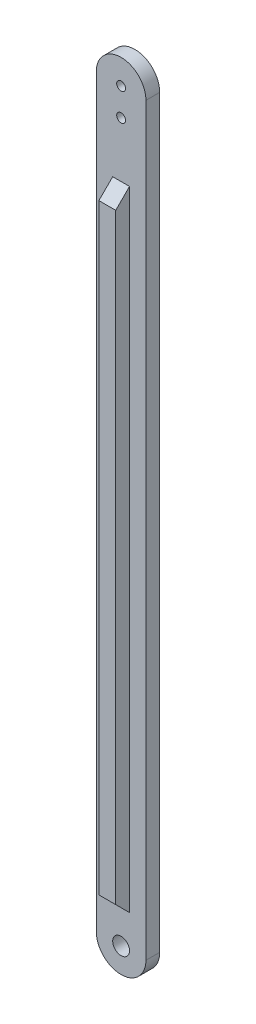
ISO-10303-21;
HEADER;
FILE_DESCRIPTION(('STEP AP214'),'2;1');
FILE_NAME('part.step','',(''),(''),'','','');
FILE_SCHEMA(('AUTOMOTIVE_DESIGN { 1 0 10303 214 1 1 1 1 }'));
ENDSEC;
DATA;
#1=APPLICATION_CONTEXT('core data for automotive mechanical design processes');
#2=APPLICATION_PROTOCOL_DEFINITION('international standard','automotive_design',2000,#1);
#3=PRODUCT_CONTEXT('',#1,'mechanical');
#4=PRODUCT('Part','Part','',(#3));
#5=PRODUCT_RELATED_PRODUCT_CATEGORY('part','',(#4));
#6=PRODUCT_DEFINITION_FORMATION('','',#4);
#7=PRODUCT_DEFINITION_CONTEXT('part definition',#1,'design');
#8=PRODUCT_DEFINITION('design','',#6,#7);
#9=PRODUCT_DEFINITION_SHAPE('','',#8);
#10=(LENGTH_UNIT() NAMED_UNIT(*) SI_UNIT(.MILLI.,.METRE.));
#11=(NAMED_UNIT(*) PLANE_ANGLE_UNIT() SI_UNIT($,.RADIAN.));
#12=(NAMED_UNIT(*) SI_UNIT($,.STERADIAN.) SOLID_ANGLE_UNIT());
#13=UNCERTAINTY_MEASURE_WITH_UNIT(LENGTH_MEASURE(1.E-05),#10,'distance_accuracy_value','');
#14=(GEOMETRIC_REPRESENTATION_CONTEXT(3) GLOBAL_UNCERTAINTY_ASSIGNED_CONTEXT((#13)) GLOBAL_UNIT_ASSIGNED_CONTEXT((#10,
#11,#12)) REPRESENTATION_CONTEXT('',''));
#15=CARTESIAN_POINT('',(0.,0.,0.));
#16=DIRECTION('',(0.,0.,1.));
#17=DIRECTION('',(1.,0.,0.));
#18=AXIS2_PLACEMENT_3D('',#15,#16,#17);
#19=CARTESIAN_POINT('',(0.,0.,5.));
#20=DIRECTION('',(0.,0.,1.));
#21=DIRECTION('',(1.,0.,0.));
#22=AXIS2_PLACEMENT_3D('',#19,#20,#21);
#23=PLANE('',#22);
#24=CARTESIAN_POINT('',(0.,270.,5.));
#25=DIRECTION('',(0.,0.,1.));
#26=DIRECTION('',(1.,0.,0.));
#27=AXIS2_PLACEMENT_3D('',#24,#25,#26);
#28=CIRCLE('',#27,1.6);
#29=CARTESIAN_POINT('',(1.6,270.,5.));
#30=VERTEX_POINT('',#29);
#31=EDGE_CURVE('E144',#30,#30,#28,.T.);
#32=ORIENTED_EDGE('',*,*,#31,.F.);
#33=EDGE_LOOP('',(#32));
#34=FACE_BOUND('',#33,.T.);
#35=CARTESIAN_POINT('',(0.,260.,5.));
#36=DIRECTION('',(0.,0.,1.));
#37=DIRECTION('',(1.,0.,0.));
#38=AXIS2_PLACEMENT_3D('',#35,#36,#37);
#39=CIRCLE('',#38,1.59999999999999);
#40=CARTESIAN_POINT('',(1.59999999999999,260.,5.));
#41=VERTEX_POINT('',#40);
#42=EDGE_CURVE('E149',#41,#41,#39,.T.);
#43=ORIENTED_EDGE('',*,*,#42,.F.);
#44=EDGE_LOOP('',(#43));
#45=FACE_BOUND('',#44,.T.);
#46=CARTESIAN_POINT('',(0.,0.,5.));
#47=DIRECTION('',(0.,0.,1.));
#48=DIRECTION('',(1.,0.,0.));
#49=AXIS2_PLACEMENT_3D('',#46,#47,#48);
#50=CIRCLE('',#49,9.00000000000003);
#51=CARTESIAN_POINT('',(-9.00000000000003,0.,5.));
#52=VERTEX_POINT('',#51);
#53=CARTESIAN_POINT('',(9.00000000000003,0.,5.));
#54=VERTEX_POINT('',#53);
#55=EDGE_CURVE('E163',#52,#54,#50,.T.);
#56=ORIENTED_EDGE('',*,*,#55,.T.);
#57=DIRECTION('',(0.,1.,0.));
#58=VECTOR('',#57,1.);
#59=CARTESIAN_POINT('',(9.,270.,5.));
#60=LINE('',#59,#58);
#61=CARTESIAN_POINT('',(9.,270.,5.));
#62=VERTEX_POINT('',#61);
#63=EDGE_CURVE('E167',#54,#62,#60,.T.);
#64=ORIENTED_EDGE('',*,*,#63,.T.);
#65=CARTESIAN_POINT('',(0.,270.,5.));
#66=DIRECTION('',(0.,0.,1.));
#67=DIRECTION('',(1.,0.,0.));
#68=AXIS2_PLACEMENT_3D('',#65,#66,#67);
#69=CIRCLE('',#68,9.);
#70=CARTESIAN_POINT('',(-9.,270.,5.));
#71=VERTEX_POINT('',#70);
#72=EDGE_CURVE('E171',#62,#71,#69,.T.);
#73=ORIENTED_EDGE('',*,*,#72,.T.);
#74=DIRECTION('',(0.,-1.,0.));
#75=VECTOR('',#74,1.);
#76=CARTESIAN_POINT('',(-9.,270.,5.));
#77=LINE('',#76,#75);
#78=EDGE_CURVE('E174',#71,#52,#77,.T.);
#79=ORIENTED_EDGE('',*,*,#78,.T.);
#80=EDGE_LOOP('',(#56,#64,#73,#79));
#81=FACE_BOUND('',#80,.T.);
#82=CARTESIAN_POINT('',(0.,0.,5.));
#83=DIRECTION('',(0.,0.,1.));
#84=DIRECTION('',(1.,0.,0.));
#85=AXIS2_PLACEMENT_3D('',#82,#83,#84);
#86=CIRCLE('',#85,3.05);
#87=CARTESIAN_POINT('',(3.05,0.,5.));
#88=VERTEX_POINT('',#87);
#89=EDGE_CURVE('E153',#88,#88,#86,.T.);
#90=ORIENTED_EDGE('',*,*,#89,.F.);
#91=EDGE_LOOP('',(#90));
#92=FACE_BOUND('',#91,.T.);
#93=DIRECTION('',(0.,-1.,0.));
#94=VECTOR('',#93,1.);
#95=CARTESIAN_POINT('',(-3.05,12.,5.));
#96=LINE('',#95,#94);
#97=CARTESIAN_POINT('',(-3.05,240.,5.));
#98=VERTEX_POINT('',#97);
#99=CARTESIAN_POINT('',(-3.05,12.,5.));
#100=VERTEX_POINT('',#99);
#101=EDGE_CURVE('E113',#98,#100,#96,.T.);
#102=ORIENTED_EDGE('',*,*,#101,.F.);
#103=DIRECTION('',(-1.,0.,0.));
#104=VECTOR('',#103,1.);
#105=CARTESIAN_POINT('',(3.05,240.,5.));
#106=LINE('',#105,#104);
#107=CARTESIAN_POINT('',(3.05,240.,5.));
#108=VERTEX_POINT('',#107);
#109=EDGE_CURVE('E127',#108,#98,#106,.T.);
#110=ORIENTED_EDGE('',*,*,#109,.F.);
#111=DIRECTION('',(0.,1.,0.));
#112=VECTOR('',#111,1.);
#113=CARTESIAN_POINT('',(3.05,12.,5.));
#114=LINE('',#113,#112);
#115=CARTESIAN_POINT('',(3.05,12.,5.));
#116=VERTEX_POINT('',#115);
#117=EDGE_CURVE('E141',#116,#108,#114,.T.);
#118=ORIENTED_EDGE('',*,*,#117,.F.);
#119=DIRECTION('',(1.,0.,0.));
#120=VECTOR('',#119,1.);
#121=CARTESIAN_POINT('',(0.,12.,5.));
#122=LINE('',#121,#120);
#123=EDGE_CURVE('E128',#100,#116,#122,.T.);
#124=ORIENTED_EDGE('',*,*,#123,.F.);
#125=EDGE_LOOP('',(#102,#110,#118,#124));
#126=FACE_BOUND('',#125,.T.);
#127=ADVANCED_FACE('F45',(#34,#45,#81,#92,#126),#23,.T.);
#128=CARTESIAN_POINT('',(0.,0.,0.));
#129=DIRECTION('',(0.,0.,1.));
#130=DIRECTION('',(1.,0.,0.));
#131=AXIS2_PLACEMENT_3D('',#128,#129,#130);
#132=PLANE('',#131);
#133=CARTESIAN_POINT('',(0.,270.,0.));
#134=DIRECTION('',(0.,0.,1.));
#135=DIRECTION('',(1.,0.,0.));
#136=AXIS2_PLACEMENT_3D('',#133,#134,#135);
#137=CIRCLE('',#136,1.6);
#138=CARTESIAN_POINT('',(1.6,270.,0.));
#139=VERTEX_POINT('',#138);
#140=EDGE_CURVE('E162',#139,#139,#137,.T.);
#141=ORIENTED_EDGE('',*,*,#140,.T.);
#142=EDGE_LOOP('',(#141));
#143=FACE_BOUND('',#142,.T.);
#144=CARTESIAN_POINT('',(0.,260.,0.));
#145=DIRECTION('',(0.,0.,1.));
#146=DIRECTION('',(1.,0.,0.));
#147=AXIS2_PLACEMENT_3D('',#144,#145,#146);
#148=CIRCLE('',#147,1.59999999999999);
#149=CARTESIAN_POINT('',(1.59999999999999,260.,0.));
#150=VERTEX_POINT('',#149);
#151=EDGE_CURVE('E148',#150,#150,#148,.T.);
#152=ORIENTED_EDGE('',*,*,#151,.T.);
#153=EDGE_LOOP('',(#152));
#154=FACE_BOUND('',#153,.T.);
#155=CARTESIAN_POINT('',(0.,0.,0.));
#156=DIRECTION('',(0.,0.,1.));
#157=DIRECTION('',(1.,0.,0.));
#158=AXIS2_PLACEMENT_3D('',#155,#156,#157);
#159=CIRCLE('',#158,9.00000000000003);
#160=CARTESIAN_POINT('',(-9.00000000000003,0.,0.));
#161=VERTEX_POINT('',#160);
#162=CARTESIAN_POINT('',(9.00000000000003,0.,0.));
#163=VERTEX_POINT('',#162);
#164=EDGE_CURVE('E157',#161,#163,#159,.T.);
#165=ORIENTED_EDGE('',*,*,#164,.F.);
#166=DIRECTION('',(0.,-1.,0.));
#167=VECTOR('',#166,1.);
#168=CARTESIAN_POINT('',(-9.,270.,0.));
#169=LINE('',#168,#167);
#170=CARTESIAN_POINT('',(-9.,270.,0.));
#171=VERTEX_POINT('',#170);
#172=EDGE_CURVE('E168',#171,#161,#169,.T.);
#173=ORIENTED_EDGE('',*,*,#172,.F.);
#174=CARTESIAN_POINT('',(0.,270.,0.));
#175=DIRECTION('',(0.,0.,1.));
#176=DIRECTION('',(1.,0.,0.));
#177=AXIS2_PLACEMENT_3D('',#174,#175,#176);
#178=CIRCLE('',#177,9.);
#179=CARTESIAN_POINT('',(9.,270.,0.));
#180=VERTEX_POINT('',#179);
#181=EDGE_CURVE('E184',#180,#171,#178,.T.);
#182=ORIENTED_EDGE('',*,*,#181,.F.);
#183=DIRECTION('',(0.,1.,0.));
#184=VECTOR('',#183,1.);
#185=CARTESIAN_POINT('',(9.,270.,0.));
#186=LINE('',#185,#184);
#187=EDGE_CURVE('E181',#163,#180,#186,.T.);
#188=ORIENTED_EDGE('',*,*,#187,.F.);
#189=EDGE_LOOP('',(#165,#173,#182,#188));
#190=FACE_BOUND('',#189,.T.);
#191=CARTESIAN_POINT('',(0.,0.,0.));
#192=DIRECTION('',(0.,0.,1.));
#193=DIRECTION('',(1.,0.,0.));
#194=AXIS2_PLACEMENT_3D('',#191,#192,#193);
#195=CIRCLE('',#194,3.05);
#196=CARTESIAN_POINT('',(3.05,0.,0.));
#197=VERTEX_POINT('',#196);
#198=EDGE_CURVE('E158',#197,#197,#195,.T.);
#199=ORIENTED_EDGE('',*,*,#198,.T.);
#200=EDGE_LOOP('',(#199));
#201=FACE_BOUND('',#200,.T.);
#202=ADVANCED_FACE('F231',(#143,#154,#190,#201),#132,.F.);
#203=CARTESIAN_POINT('',(0.,0.,5.));
#204=DIRECTION('',(0.,0.,-1.));
#205=DIRECTION('',(-1.,0.,0.));
#206=AXIS2_PLACEMENT_3D('',#203,#204,#205);
#207=CYLINDRICAL_SURFACE('',#206,9.00000000000003);
#208=ORIENTED_EDGE('',*,*,#164,.T.);
#209=DIRECTION('',(0.,0.,-1.));
#210=VECTOR('',#209,1.);
#211=CARTESIAN_POINT('',(9.00000000000003,0.,5.));
#212=LINE('',#211,#210);
#213=EDGE_CURVE('E200',#54,#163,#212,.T.);
#214=ORIENTED_EDGE('',*,*,#213,.F.);
#215=ORIENTED_EDGE('',*,*,#55,.F.);
#216=DIRECTION('',(0.,0.,-1.));
#217=VECTOR('',#216,1.);
#218=CARTESIAN_POINT('',(-9.00000000000003,0.,5.));
#219=LINE('',#218,#217);
#220=EDGE_CURVE('E177',#52,#161,#219,.T.);
#221=ORIENTED_EDGE('',*,*,#220,.T.);
#222=EDGE_LOOP('',(#208,#214,#215,#221));
#223=FACE_BOUND('',#222,.T.);
#224=ADVANCED_FACE('F237',(#223),#207,.T.);
#225=CARTESIAN_POINT('',(9.,270.,5.));
#226=DIRECTION('',(-1.,0.,0.));
#227=DIRECTION('',(0.,-1.,0.));
#228=AXIS2_PLACEMENT_3D('',#225,#226,#227);
#229=PLANE('',#228);
#230=ORIENTED_EDGE('',*,*,#187,.T.);
#231=DIRECTION('',(0.,0.,-1.));
#232=VECTOR('',#231,1.);
#233=CARTESIAN_POINT('',(9.,270.,5.));
#234=LINE('',#233,#232);
#235=EDGE_CURVE('E196',#62,#180,#234,.T.);
#236=ORIENTED_EDGE('',*,*,#235,.F.);
#237=ORIENTED_EDGE('',*,*,#63,.F.);
#238=ORIENTED_EDGE('',*,*,#213,.T.);
#239=EDGE_LOOP('',(#230,#236,#237,#238));
#240=FACE_BOUND('',#239,.T.);
#241=ADVANCED_FACE('F253',(#240),#229,.F.);
#242=CARTESIAN_POINT('',(0.,270.,5.));
#243=DIRECTION('',(0.,0.,-1.));
#244=DIRECTION('',(-1.,0.,0.));
#245=AXIS2_PLACEMENT_3D('',#242,#243,#244);
#246=CYLINDRICAL_SURFACE('',#245,9.);
#247=ORIENTED_EDGE('',*,*,#181,.T.);
#248=DIRECTION('',(0.,0.,-1.));
#249=VECTOR('',#248,1.);
#250=CARTESIAN_POINT('',(-9.,270.,5.));
#251=LINE('',#250,#249);
#252=EDGE_CURVE('E192',#71,#171,#251,.T.);
#253=ORIENTED_EDGE('',*,*,#252,.F.);
#254=ORIENTED_EDGE('',*,*,#72,.F.);
#255=ORIENTED_EDGE('',*,*,#235,.T.);
#256=EDGE_LOOP('',(#247,#253,#254,#255));
#257=FACE_BOUND('',#256,.T.);
#258=ADVANCED_FACE('F249',(#257),#246,.T.);
#259=CARTESIAN_POINT('',(-9.,270.,5.));
#260=DIRECTION('',(1.,0.,0.));
#261=DIRECTION('',(0.,1.,0.));
#262=AXIS2_PLACEMENT_3D('',#259,#260,#261);
#263=PLANE('',#262);
#264=ORIENTED_EDGE('',*,*,#172,.T.);
#265=ORIENTED_EDGE('',*,*,#220,.F.);
#266=ORIENTED_EDGE('',*,*,#78,.F.);
#267=ORIENTED_EDGE('',*,*,#252,.T.);
#268=EDGE_LOOP('',(#264,#265,#266,#267));
#269=FACE_BOUND('',#268,.T.);
#270=ADVANCED_FACE('F246',(#269),#263,.F.);
#271=CARTESIAN_POINT('',(0.,0.,5.));
#272=DIRECTION('',(0.,0.,-1.));
#273=DIRECTION('',(-1.,0.,0.));
#274=AXIS2_PLACEMENT_3D('',#271,#272,#273);
#275=CYLINDRICAL_SURFACE('',#274,3.05);
#276=ORIENTED_EDGE('',*,*,#89,.T.);
#277=EDGE_LOOP('',(#276));
#278=FACE_BOUND('',#277,.T.);
#279=ORIENTED_EDGE('',*,*,#198,.F.);
#280=EDGE_LOOP('',(#279));
#281=FACE_BOUND('',#280,.T.);
#282=ADVANCED_FACE('F243',(#278,#281),#275,.F.);
#283=CARTESIAN_POINT('',(0.,260.,-5.));
#284=DIRECTION('',(0.,0.,1.));
#285=DIRECTION('',(1.,0.,0.));
#286=AXIS2_PLACEMENT_3D('',#283,#284,#285);
#287=CYLINDRICAL_SURFACE('',#286,1.59999999999999);
#288=ORIENTED_EDGE('',*,*,#42,.T.);
#289=EDGE_LOOP('',(#288));
#290=FACE_BOUND('',#289,.T.);
#291=ORIENTED_EDGE('',*,*,#151,.F.);
#292=EDGE_LOOP('',(#291));
#293=FACE_BOUND('',#292,.T.);
#294=ADVANCED_FACE('F285',(#290,#293),#287,.F.);
#295=CARTESIAN_POINT('',(0.,270.,-5.));
#296=DIRECTION('',(0.,0.,1.));
#297=DIRECTION('',(1.,0.,0.));
#298=AXIS2_PLACEMENT_3D('',#295,#296,#297);
#299=CYLINDRICAL_SURFACE('',#298,1.6);
#300=ORIENTED_EDGE('',*,*,#31,.T.);
#301=EDGE_LOOP('',(#300));
#302=FACE_BOUND('',#301,.T.);
#303=ORIENTED_EDGE('',*,*,#140,.F.);
#304=EDGE_LOOP('',(#303));
#305=FACE_BOUND('',#304,.T.);
#306=ADVANCED_FACE('F290',(#302,#305),#299,.F.);
#307=CARTESIAN_POINT('',(-3.05,12.,10.));
#308=DIRECTION('',(1.,0.,0.));
#309=DIRECTION('',(0.,0.,-1.));
#310=AXIS2_PLACEMENT_3D('',#307,#308,#309);
#311=PLANE('',#310);
#312=DIRECTION('',(0.,-1.,0.));
#313=VECTOR('',#312,1.);
#314=CARTESIAN_POINT('',(-3.05,12.,10.));
#315=LINE('',#314,#313);
#316=CARTESIAN_POINT('',(-3.05,235.,10.));
#317=VERTEX_POINT('',#316);
#318=CARTESIAN_POINT('',(-3.05,17.,10.));
#319=VERTEX_POINT('',#318);
#320=EDGE_CURVE('E116',#317,#319,#315,.T.);
#321=ORIENTED_EDGE('',*,*,#320,.F.);
#322=DIRECTION('',(0.,-0.707106781186546,0.707106781186549));
#323=VECTOR('',#322,1.);
#324=CARTESIAN_POINT('',(-3.05,235.,10.));
#325=LINE('',#324,#323);
#326=EDGE_CURVE('E110',#317,#98,#325,.F.);
#327=ORIENTED_EDGE('',*,*,#326,.T.);
#328=ORIENTED_EDGE('',*,*,#101,.T.);
#329=DIRECTION('',(0.,-0.707106781186546,-0.707106781186549));
#330=VECTOR('',#329,1.);
#331=CARTESIAN_POINT('',(-3.05,17.,10.));
#332=LINE('',#331,#330);
#333=EDGE_CURVE('E122',#100,#319,#332,.F.);
#334=ORIENTED_EDGE('',*,*,#333,.T.);
#335=EDGE_LOOP('',(#321,#327,#328,#334));
#336=FACE_BOUND('',#335,.T.);
#337=ADVANCED_FACE('F112',(#336),#311,.F.);
#338=CARTESIAN_POINT('',(3.05,12.,10.));
#339=DIRECTION('',(-1.,0.,0.));
#340=DIRECTION('',(0.,0.,1.));
#341=AXIS2_PLACEMENT_3D('',#338,#339,#340);
#342=PLANE('',#341);
#343=ORIENTED_EDGE('',*,*,#117,.T.);
#344=DIRECTION('',(0.,0.707106781186546,-0.707106781186549));
#345=VECTOR('',#344,1.);
#346=CARTESIAN_POINT('',(3.05,235.,10.));
#347=LINE('',#346,#345);
#348=CARTESIAN_POINT('',(3.05,235.,10.));
#349=VERTEX_POINT('',#348);
#350=EDGE_CURVE('E11',#108,#349,#347,.F.);
#351=ORIENTED_EDGE('',*,*,#350,.T.);
#352=DIRECTION('',(0.,1.,0.));
#353=VECTOR('',#352,1.);
#354=CARTESIAN_POINT('',(3.05,12.,10.));
#355=LINE('',#354,#353);
#356=CARTESIAN_POINT('',(3.05,17.,10.));
#357=VERTEX_POINT('',#356);
#358=EDGE_CURVE('E136',#357,#349,#355,.T.);
#359=ORIENTED_EDGE('',*,*,#358,.F.);
#360=DIRECTION('',(0.,0.707106781186546,0.707106781186549));
#361=VECTOR('',#360,1.);
#362=CARTESIAN_POINT('',(3.05,17.,10.));
#363=LINE('',#362,#361);
#364=EDGE_CURVE('E55',#357,#116,#363,.F.);
#365=ORIENTED_EDGE('',*,*,#364,.T.);
#366=EDGE_LOOP('',(#343,#351,#359,#365));
#367=FACE_BOUND('',#366,.T.);
#368=ADVANCED_FACE('F218',(#367),#342,.F.);
#369=CARTESIAN_POINT('',(0.,0.,10.));
#370=DIRECTION('',(0.,0.,-1.));
#371=DIRECTION('',(-1.,0.,0.));
#372=AXIS2_PLACEMENT_3D('',#369,#370,#371);
#373=PLANE('',#372);
#374=ORIENTED_EDGE('',*,*,#358,.T.);
#375=DIRECTION('',(-1.,0.,0.));
#376=VECTOR('',#375,1.);
#377=CARTESIAN_POINT('',(0.,235.,10.));
#378=LINE('',#377,#376);
#379=EDGE_CURVE('E213',#349,#317,#378,.T.);
#380=ORIENTED_EDGE('',*,*,#379,.T.);
#381=ORIENTED_EDGE('',*,*,#320,.T.);
#382=DIRECTION('',(1.,0.,0.));
#383=VECTOR('',#382,1.);
#384=CARTESIAN_POINT('',(0.,17.,10.));
#385=LINE('',#384,#383);
#386=EDGE_CURVE('E204',#319,#357,#385,.T.);
#387=ORIENTED_EDGE('',*,*,#386,.T.);
#388=EDGE_LOOP('',(#374,#380,#381,#387));
#389=FACE_BOUND('',#388,.T.);
#390=ADVANCED_FACE('F220',(#389),#373,.F.);
#391=CARTESIAN_POINT('',(0.,235.,10.));
#392=DIRECTION('',(0.,-0.707106781186549,-0.707106781186545));
#393=DIRECTION('',(-1.,0.,0.));
#394=AXIS2_PLACEMENT_3D('',#391,#392,#393);
#395=PLANE('',#394);
#396=ORIENTED_EDGE('',*,*,#350,.F.);
#397=ORIENTED_EDGE('',*,*,#109,.T.);
#398=ORIENTED_EDGE('',*,*,#326,.F.);
#399=ORIENTED_EDGE('',*,*,#379,.F.);
#400=EDGE_LOOP('',(#396,#397,#398,#399));
#401=FACE_BOUND('',#400,.T.);
#402=ADVANCED_FACE('F132',(#401),#395,.F.);
#403=CARTESIAN_POINT('',(0.,17.,10.));
#404=DIRECTION('',(0.,0.707106781186549,-0.707106781186546));
#405=DIRECTION('',(1.,0.,0.));
#406=AXIS2_PLACEMENT_3D('',#403,#404,#405);
#407=PLANE('',#406);
#408=ORIENTED_EDGE('',*,*,#333,.F.);
#409=ORIENTED_EDGE('',*,*,#123,.T.);
#410=ORIENTED_EDGE('',*,*,#364,.F.);
#411=ORIENTED_EDGE('',*,*,#386,.F.);
#412=EDGE_LOOP('',(#408,#409,#410,#411));
#413=FACE_BOUND('',#412,.T.);
#414=ADVANCED_FACE('F48',(#413),#407,.F.);
#415=CLOSED_SHELL('',(#127,#202,#224,#241,#258,#270,#282,#294,#306,#337,#368,#390,#402,#414));
#416=MANIFOLD_SOLID_BREP('B2',#415);
#417=ADVANCED_BREP_SHAPE_REPRESENTATION('',(#18,#416),#14);
#418=SHAPE_DEFINITION_REPRESENTATION(#9,#417);
ENDSEC;
END-ISO-10303-21;
